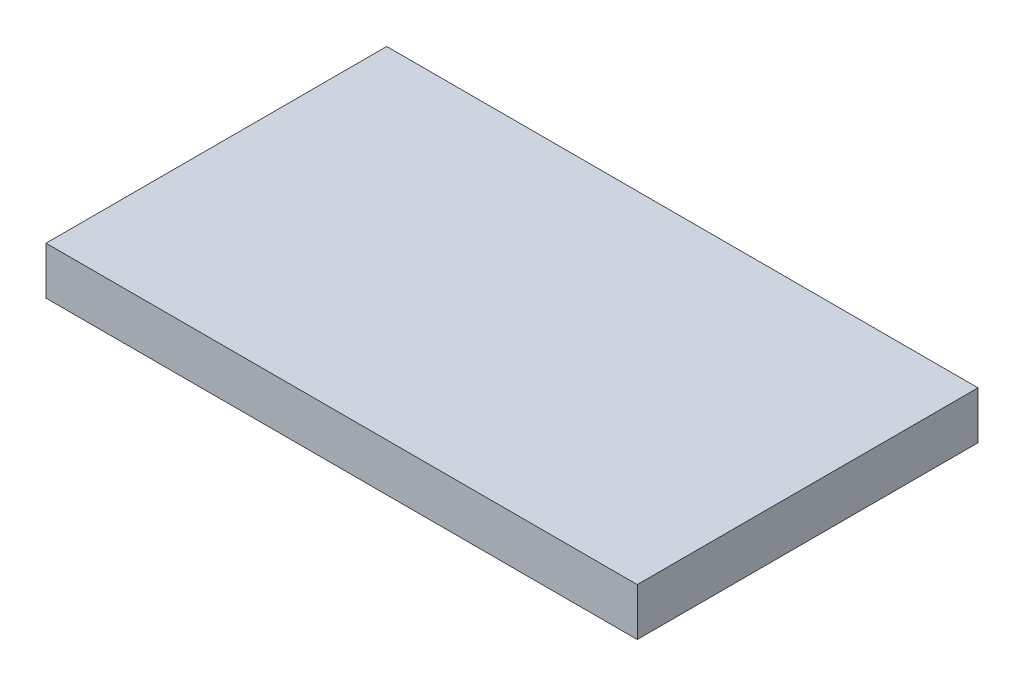
ISO-10303-21;
HEADER;
FILE_DESCRIPTION(('STEP AP214'),'2;1');
FILE_NAME('part.step','',(''),(''),'','','');
FILE_SCHEMA(('AUTOMOTIVE_DESIGN { 1 0 10303 214 1 1 1 1 }'));
ENDSEC;
DATA;
#1=APPLICATION_CONTEXT('core data for automotive mechanical design processes');
#2=APPLICATION_PROTOCOL_DEFINITION('international standard','automotive_design',2000,#1);
#3=PRODUCT_CONTEXT('',#1,'mechanical');
#4=PRODUCT('Part','Part','',(#3));
#5=PRODUCT_RELATED_PRODUCT_CATEGORY('part','',(#4));
#6=PRODUCT_DEFINITION_FORMATION('','',#4);
#7=PRODUCT_DEFINITION_CONTEXT('part definition',#1,'design');
#8=PRODUCT_DEFINITION('design','',#6,#7);
#9=PRODUCT_DEFINITION_SHAPE('','',#8);
#10=(LENGTH_UNIT() NAMED_UNIT(*) SI_UNIT(.MILLI.,.METRE.));
#11=(NAMED_UNIT(*) PLANE_ANGLE_UNIT() SI_UNIT($,.RADIAN.));
#12=(NAMED_UNIT(*) SI_UNIT($,.STERADIAN.) SOLID_ANGLE_UNIT());
#13=UNCERTAINTY_MEASURE_WITH_UNIT(LENGTH_MEASURE(1.E-05),#10,'distance_accuracy_value','');
#14=(GEOMETRIC_REPRESENTATION_CONTEXT(3) GLOBAL_UNCERTAINTY_ASSIGNED_CONTEXT((#13)) GLOBAL_UNIT_ASSIGNED_CONTEXT((#10,
#11,#12)) REPRESENTATION_CONTEXT('',''));
#15=CARTESIAN_POINT('',(0.,0.,0.));
#16=DIRECTION('',(0.,0.,1.));
#17=DIRECTION('',(1.,0.,0.));
#18=AXIS2_PLACEMENT_3D('',#15,#16,#17);
#19=CARTESIAN_POINT('',(0.,9.5,0.));
#20=DIRECTION('',(-1.,0.,0.));
#21=DIRECTION('',(0.,0.,1.));
#22=AXIS2_PLACEMENT_3D('',#19,#20,#21);
#23=PLANE('',#22);
#24=DIRECTION('',(0.,0.,-1.));
#25=VECTOR('',#24,1.);
#26=CARTESIAN_POINT('',(0.,0.,0.));
#27=LINE('',#26,#25);
#28=CARTESIAN_POINT('',(0.,0.,0.));
#29=VERTEX_POINT('',#28);
#30=CARTESIAN_POINT('',(0.,0.,-68.));
#31=VERTEX_POINT('',#30);
#32=EDGE_CURVE('E97',#29,#31,#27,.T.);
#33=ORIENTED_EDGE('',*,*,#32,.T.);
#34=DIRECTION('',(0.,-1.,0.));
#35=VECTOR('',#34,1.);
#36=CARTESIAN_POINT('',(0.,9.5,-68.));
#37=LINE('',#36,#35);
#38=CARTESIAN_POINT('',(0.,9.5,-68.));
#39=VERTEX_POINT('',#38);
#40=EDGE_CURVE('E11',#39,#31,#37,.T.);
#41=ORIENTED_EDGE('',*,*,#40,.F.);
#42=DIRECTION('',(0.,0.,-1.));
#43=VECTOR('',#42,1.);
#44=CARTESIAN_POINT('',(0.,9.5,0.));
#45=LINE('',#44,#43);
#46=CARTESIAN_POINT('',(0.,9.5,0.));
#47=VERTEX_POINT('',#46);
#48=EDGE_CURVE('E85',#47,#39,#45,.T.);
#49=ORIENTED_EDGE('',*,*,#48,.F.);
#50=DIRECTION('',(0.,-1.,0.));
#51=VECTOR('',#50,1.);
#52=CARTESIAN_POINT('',(0.,9.5,0.));
#53=LINE('',#52,#51);
#54=EDGE_CURVE('E93',#47,#29,#53,.T.);
#55=ORIENTED_EDGE('',*,*,#54,.T.);
#56=EDGE_LOOP('',(#33,#41,#49,#55));
#57=FACE_BOUND('',#56,.T.);
#58=ADVANCED_FACE('F34',(#57),#23,.F.);
#59=CARTESIAN_POINT('',(0.,9.5,-68.));
#60=DIRECTION('',(0.,0.,1.));
#61=DIRECTION('',(1.,0.,0.));
#62=AXIS2_PLACEMENT_3D('',#59,#60,#61);
#63=PLANE('',#62);
#64=DIRECTION('',(-1.,0.,0.));
#65=VECTOR('',#64,1.);
#66=CARTESIAN_POINT('',(0.,0.,-68.));
#67=LINE('',#66,#65);
#68=CARTESIAN_POINT('',(-118.,0.,-68.));
#69=VERTEX_POINT('',#68);
#70=EDGE_CURVE('E89',#31,#69,#67,.T.);
#71=ORIENTED_EDGE('',*,*,#70,.T.);
#72=DIRECTION('',(0.,-1.,0.));
#73=VECTOR('',#72,1.);
#74=CARTESIAN_POINT('',(-118.,9.5,-68.));
#75=LINE('',#74,#73);
#76=CARTESIAN_POINT('',(-118.,9.5,-68.));
#77=VERTEX_POINT('',#76);
#78=EDGE_CURVE('E42',#77,#69,#75,.T.);
#79=ORIENTED_EDGE('',*,*,#78,.F.);
#80=DIRECTION('',(-1.,0.,0.));
#81=VECTOR('',#80,1.);
#82=CARTESIAN_POINT('',(0.,9.5,-68.));
#83=LINE('',#82,#81);
#84=EDGE_CURVE('E80',#39,#77,#83,.T.);
#85=ORIENTED_EDGE('',*,*,#84,.F.);
#86=ORIENTED_EDGE('',*,*,#40,.T.);
#87=EDGE_LOOP('',(#71,#79,#85,#86));
#88=FACE_BOUND('',#87,.T.);
#89=ADVANCED_FACE('F88',(#88),#63,.F.);
#90=CARTESIAN_POINT('',(-118.,9.5,0.));
#91=DIRECTION('',(1.,0.,0.));
#92=DIRECTION('',(0.,0.,-1.));
#93=AXIS2_PLACEMENT_3D('',#90,#91,#92);
#94=PLANE('',#93);
#95=DIRECTION('',(0.,0.,1.));
#96=VECTOR('',#95,1.);
#97=CARTESIAN_POINT('',(-118.,0.,0.));
#98=LINE('',#97,#96);
#99=CARTESIAN_POINT('',(-118.,0.,0.));
#100=VERTEX_POINT('',#99);
#101=EDGE_CURVE('E67',#69,#100,#98,.T.);
#102=ORIENTED_EDGE('',*,*,#101,.T.);
#103=DIRECTION('',(0.,-1.,0.));
#104=VECTOR('',#103,1.);
#105=CARTESIAN_POINT('',(-118.,9.5,0.));
#106=LINE('',#105,#104);
#107=CARTESIAN_POINT('',(-118.,9.5,0.));
#108=VERTEX_POINT('',#107);
#109=EDGE_CURVE('E90',#108,#100,#106,.T.);
#110=ORIENTED_EDGE('',*,*,#109,.F.);
#111=DIRECTION('',(0.,0.,1.));
#112=VECTOR('',#111,1.);
#113=CARTESIAN_POINT('',(-118.,9.5,0.));
#114=LINE('',#113,#112);
#115=EDGE_CURVE('E83',#77,#108,#114,.T.);
#116=ORIENTED_EDGE('',*,*,#115,.F.);
#117=ORIENTED_EDGE('',*,*,#78,.T.);
#118=EDGE_LOOP('',(#102,#110,#116,#117));
#119=FACE_BOUND('',#118,.T.);
#120=ADVANCED_FACE('F91',(#119),#94,.F.);
#121=CARTESIAN_POINT('',(0.,9.5,0.));
#122=DIRECTION('',(0.,0.,-1.));
#123=DIRECTION('',(-1.,0.,0.));
#124=AXIS2_PLACEMENT_3D('',#121,#122,#123);
#125=PLANE('',#124);
#126=DIRECTION('',(1.,0.,0.));
#127=VECTOR('',#126,1.);
#128=CARTESIAN_POINT('',(0.,0.,0.));
#129=LINE('',#128,#127);
#130=EDGE_CURVE('E73',#100,#29,#129,.T.);
#131=ORIENTED_EDGE('',*,*,#130,.T.);
#132=ORIENTED_EDGE('',*,*,#54,.F.);
#133=DIRECTION('',(1.,0.,0.));
#134=VECTOR('',#133,1.);
#135=CARTESIAN_POINT('',(0.,9.5,0.));
#136=LINE('',#135,#134);
#137=EDGE_CURVE('E50',#108,#47,#136,.T.);
#138=ORIENTED_EDGE('',*,*,#137,.F.);
#139=ORIENTED_EDGE('',*,*,#109,.T.);
#140=EDGE_LOOP('',(#131,#132,#138,#139));
#141=FACE_BOUND('',#140,.T.);
#142=ADVANCED_FACE('F104',(#141),#125,.F.);
#143=CARTESIAN_POINT('',(0.,9.5,0.));
#144=DIRECTION('',(0.,1.,0.));
#145=DIRECTION('',(0.,0.,1.));
#146=AXIS2_PLACEMENT_3D('',#143,#144,#145);
#147=PLANE('',#146);
#148=ORIENTED_EDGE('',*,*,#48,.T.);
#149=ORIENTED_EDGE('',*,*,#84,.T.);
#150=ORIENTED_EDGE('',*,*,#115,.T.);
#151=ORIENTED_EDGE('',*,*,#137,.T.);
#152=EDGE_LOOP('',(#148,#149,#150,#151));
#153=FACE_BOUND('',#152,.T.);
#154=ADVANCED_FACE('F81',(#153),#147,.T.);
#155=CARTESIAN_POINT('',(0.,0.,0.));
#156=DIRECTION('',(0.,1.,0.));
#157=DIRECTION('',(0.,0.,1.));
#158=AXIS2_PLACEMENT_3D('',#155,#156,#157);
#159=PLANE('',#158);
#160=ORIENTED_EDGE('',*,*,#32,.F.);
#161=ORIENTED_EDGE('',*,*,#130,.F.);
#162=ORIENTED_EDGE('',*,*,#101,.F.);
#163=ORIENTED_EDGE('',*,*,#70,.F.);
#164=EDGE_LOOP('',(#160,#161,#162,#163));
#165=FACE_BOUND('',#164,.T.);
#166=ADVANCED_FACE('F107',(#165),#159,.F.);
#167=CLOSED_SHELL('',(#58,#89,#120,#142,#154,#166));
#168=MANIFOLD_SOLID_BREP('B2',#167);
#169=ADVANCED_BREP_SHAPE_REPRESENTATION('',(#18,#168),#14);
#170=SHAPE_DEFINITION_REPRESENTATION(#9,#169);
ENDSEC;
END-ISO-10303-21;
